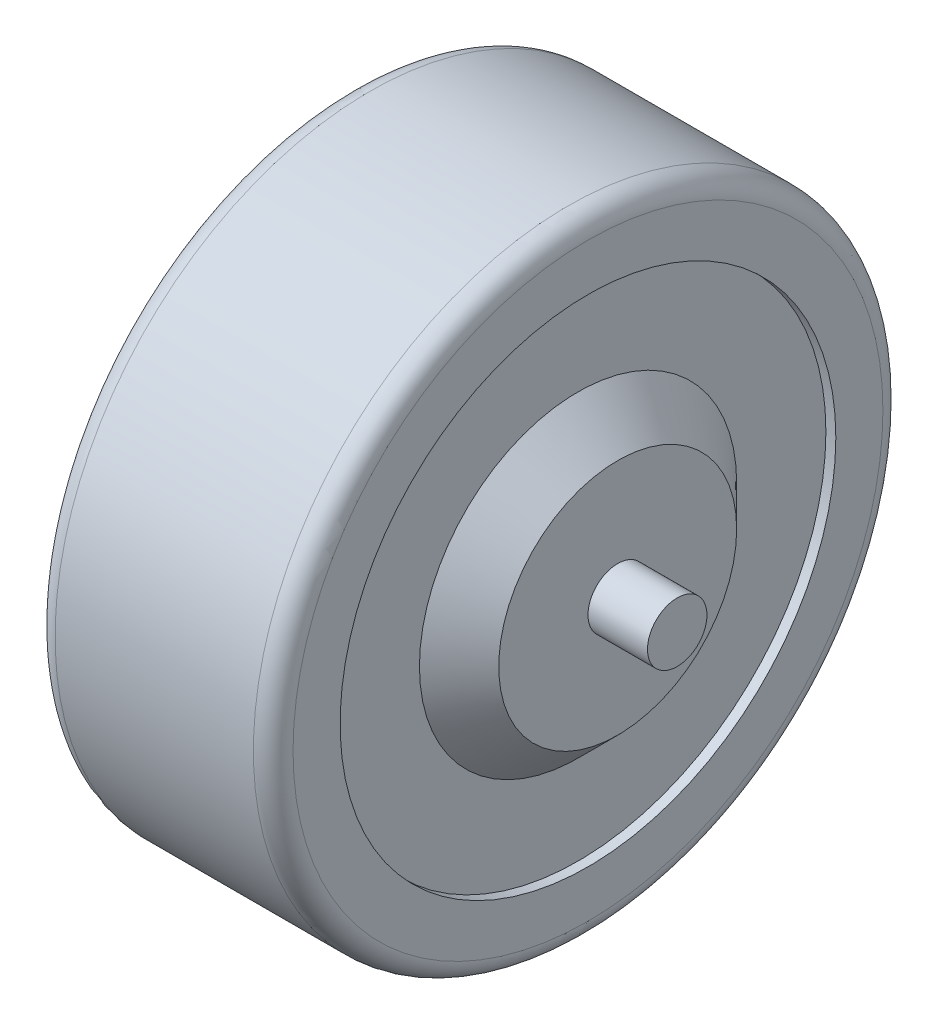
ISO-10303-21;
HEADER;
FILE_DESCRIPTION(('STEP AP214'),'2;1');
FILE_NAME('part.step','',(''),(''),'','','');
FILE_SCHEMA(('AUTOMOTIVE_DESIGN { 1 0 10303 214 1 1 1 1 }'));
ENDSEC;
DATA;
#1=APPLICATION_CONTEXT('core data for automotive mechanical design processes');
#2=APPLICATION_PROTOCOL_DEFINITION('international standard','automotive_design',2000,#1);
#3=PRODUCT_CONTEXT('',#1,'mechanical');
#4=PRODUCT('Part','Part','',(#3));
#5=PRODUCT_RELATED_PRODUCT_CATEGORY('part','',(#4));
#6=PRODUCT_DEFINITION_FORMATION('','',#4);
#7=PRODUCT_DEFINITION_CONTEXT('part definition',#1,'design');
#8=PRODUCT_DEFINITION('design','',#6,#7);
#9=PRODUCT_DEFINITION_SHAPE('','',#8);
#10=(LENGTH_UNIT() NAMED_UNIT(*) SI_UNIT(.MILLI.,.METRE.));
#11=(NAMED_UNIT(*) PLANE_ANGLE_UNIT() SI_UNIT($,.RADIAN.));
#12=(NAMED_UNIT(*) SI_UNIT($,.STERADIAN.) SOLID_ANGLE_UNIT());
#13=UNCERTAINTY_MEASURE_WITH_UNIT(LENGTH_MEASURE(1.E-05),#10,'distance_accuracy_value','');
#14=(GEOMETRIC_REPRESENTATION_CONTEXT(3) GLOBAL_UNCERTAINTY_ASSIGNED_CONTEXT((#13)) GLOBAL_UNIT_ASSIGNED_CONTEXT((#10,
#11,#12)) REPRESENTATION_CONTEXT('',''));
#15=CARTESIAN_POINT('',(0.,0.,0.));
#16=DIRECTION('',(0.,0.,1.));
#17=DIRECTION('',(1.,0.,0.));
#18=AXIS2_PLACEMENT_3D('',#15,#16,#17);
#19=CARTESIAN_POINT('',(11.6415,0.,0.));
#20=DIRECTION('',(1.,0.,0.));
#21=DIRECTION('',(0.,0.,-1.));
#22=AXIS2_PLACEMENT_3D('',#19,#20,#21);
#23=PLANE('',#22);
#24=CARTESIAN_POINT('',(11.6415,0.,0.));
#25=DIRECTION('',(1.,0.,0.));
#26=DIRECTION('',(0.,0.,-1.));
#27=AXIS2_PLACEMENT_3D('',#24,#25,#26);
#28=CIRCLE('',#27,9.3132);
#29=CARTESIAN_POINT('',(11.6415,0.,-9.3132));
#30=VERTEX_POINT('',#29);
#31=EDGE_CURVE('E68',#30,#30,#28,.T.);
#32=ORIENTED_EDGE('',*,*,#31,.T.);
#33=EDGE_LOOP('',(#32));
#34=FACE_BOUND('',#33,.T.);
#35=CARTESIAN_POINT('',(11.6415,0.,0.));
#36=DIRECTION('',(1.,0.,0.));
#37=DIRECTION('',(0.,0.,-1.));
#38=AXIS2_PLACEMENT_3D('',#35,#36,#37);
#39=CIRCLE('',#38,2.3283);
#40=CARTESIAN_POINT('',(11.6415,0.,-2.3283));
#41=VERTEX_POINT('',#40);
#42=EDGE_CURVE('E101',#41,#41,#39,.T.);
#43=ORIENTED_EDGE('',*,*,#42,.F.);
#44=EDGE_LOOP('',(#43));
#45=FACE_BOUND('',#44,.T.);
#46=ADVANCED_FACE('F40',(#34,#45),#23,.T.);
#47=CARTESIAN_POINT('',(-9.3132,0.,0.));
#48=DIRECTION('',(1.,0.,0.));
#49=DIRECTION('',(0.,0.,-1.));
#50=AXIS2_PLACEMENT_3D('',#47,#48,#49);
#51=PLANE('',#50);
#52=CARTESIAN_POINT('',(-9.3132,0.,0.));
#53=DIRECTION('',(1.,0.,0.));
#54=DIRECTION('',(0.,0.,-1.));
#55=AXIS2_PLACEMENT_3D('',#52,#53,#54);
#56=CIRCLE('',#55,23.088975);
#57=CARTESIAN_POINT('',(-9.3132,0.,-23.088975));
#58=VERTEX_POINT('',#57);
#59=EDGE_CURVE('E48',#58,#58,#56,.F.);
#60=ORIENTED_EDGE('',*,*,#59,.T.);
#61=EDGE_LOOP('',(#60));
#62=FACE_BOUND('',#61,.T.);
#63=CARTESIAN_POINT('',(-9.3132,0.,0.));
#64=DIRECTION('',(1.,0.,0.));
#65=DIRECTION('',(0.,0.,-1.));
#66=AXIS2_PLACEMENT_3D('',#63,#64,#65);
#67=CIRCLE('',#66,19.4025);
#68=CARTESIAN_POINT('',(-9.3132,0.,-19.4025));
#69=VERTEX_POINT('',#68);
#70=EDGE_CURVE('E89',#69,#69,#67,.T.);
#71=ORIENTED_EDGE('',*,*,#70,.T.);
#72=EDGE_LOOP('',(#71));
#73=FACE_BOUND('',#72,.T.);
#74=ADVANCED_FACE('F124',(#62,#73),#51,.F.);
#75=CARTESIAN_POINT('',(-9.3132,0.,0.));
#76=DIRECTION('',(1.,0.,0.));
#77=DIRECTION('',(0.,0.,-1.));
#78=AXIS2_PLACEMENT_3D('',#75,#76,#77);
#79=CYLINDRICAL_SURFACE('',#78,24.641175);
#80=CARTESIAN_POINT('',(7.761,0.,0.));
#81=DIRECTION('',(1.,0.,0.));
#82=DIRECTION('',(0.,0.,-1.));
#83=AXIS2_PLACEMENT_3D('',#80,#81,#82);
#84=CIRCLE('',#83,24.641175);
#85=CARTESIAN_POINT('',(7.761,0.,-24.641175));
#86=VERTEX_POINT('',#85);
#87=EDGE_CURVE('E53',#86,#86,#84,.F.);
#88=ORIENTED_EDGE('',*,*,#87,.T.);
#89=EDGE_LOOP('',(#88));
#90=FACE_BOUND('',#89,.T.);
#91=CARTESIAN_POINT('',(-7.761,0.,0.));
#92=DIRECTION('',(1.,0.,0.));
#93=DIRECTION('',(0.,0.,-1.));
#94=AXIS2_PLACEMENT_3D('',#91,#92,#93);
#95=CIRCLE('',#94,24.641175);
#96=CARTESIAN_POINT('',(-7.761,0.,-24.641175));
#97=VERTEX_POINT('',#96);
#98=EDGE_CURVE('E58',#97,#97,#95,.T.);
#99=ORIENTED_EDGE('',*,*,#98,.T.);
#100=EDGE_LOOP('',(#99));
#101=FACE_BOUND('',#100,.T.);
#102=ADVANCED_FACE('F130',(#90,#101),#79,.T.);
#103=CARTESIAN_POINT('',(9.3132,0.,0.));
#104=DIRECTION('',(1.,0.,0.));
#105=DIRECTION('',(0.,0.,-1.));
#106=AXIS2_PLACEMENT_3D('',#103,#104,#105);
#107=PLANE('',#106);
#108=CARTESIAN_POINT('',(9.3132,0.,0.));
#109=DIRECTION('',(1.,0.,0.));
#110=DIRECTION('',(0.,0.,-1.));
#111=AXIS2_PLACEMENT_3D('',#108,#109,#110);
#112=CIRCLE('',#111,23.088975);
#113=CARTESIAN_POINT('',(9.3132,0.,-23.088975));
#114=VERTEX_POINT('',#113);
#115=EDGE_CURVE('E64',#114,#114,#112,.T.);
#116=ORIENTED_EDGE('',*,*,#115,.T.);
#117=EDGE_LOOP('',(#116));
#118=FACE_BOUND('',#117,.T.);
#119=CARTESIAN_POINT('',(9.3132,0.,0.));
#120=DIRECTION('',(1.,0.,0.));
#121=DIRECTION('',(0.,0.,-1.));
#122=AXIS2_PLACEMENT_3D('',#119,#120,#121);
#123=CIRCLE('',#122,19.4025);
#124=CARTESIAN_POINT('',(9.3132,0.,-19.4025));
#125=VERTEX_POINT('',#124);
#126=EDGE_CURVE('E77',#125,#125,#123,.T.);
#127=ORIENTED_EDGE('',*,*,#126,.F.);
#128=EDGE_LOOP('',(#127));
#129=FACE_BOUND('',#128,.T.);
#130=ADVANCED_FACE('F145',(#118,#129),#107,.T.);
#131=CARTESIAN_POINT('',(8.5371,0.,0.));
#132=DIRECTION('',(1.,0.,0.));
#133=DIRECTION('',(0.,0.,-1.));
#134=AXIS2_PLACEMENT_3D('',#131,#132,#133);
#135=CYLINDRICAL_SURFACE('',#134,19.4025);
#136=CARTESIAN_POINT('',(8.5371,0.,0.));
#137=DIRECTION('',(1.,0.,0.));
#138=DIRECTION('',(0.,0.,-1.));
#139=AXIS2_PLACEMENT_3D('',#136,#137,#138);
#140=CIRCLE('',#139,19.4025);
#141=CARTESIAN_POINT('',(8.5371,0.,-19.4025));
#142=VERTEX_POINT('',#141);
#143=EDGE_CURVE('E76',#142,#142,#140,.T.);
#144=ORIENTED_EDGE('',*,*,#143,.F.);
#145=EDGE_LOOP('',(#144));
#146=FACE_BOUND('',#145,.T.);
#147=ORIENTED_EDGE('',*,*,#126,.T.);
#148=EDGE_LOOP('',(#147));
#149=FACE_BOUND('',#148,.T.);
#150=ADVANCED_FACE('F141',(#146,#149),#135,.F.);
#151=CARTESIAN_POINT('',(8.5371,0.,0.));
#152=DIRECTION('',(1.,0.,0.));
#153=DIRECTION('',(0.,0.,-1.));
#154=AXIS2_PLACEMENT_3D('',#151,#152,#153);
#155=PLANE('',#154);
#156=CARTESIAN_POINT('',(8.5371,0.,0.));
#157=DIRECTION('',(1.,0.,0.));
#158=DIRECTION('',(0.,0.,-1.));
#159=AXIS2_PLACEMENT_3D('',#156,#157,#158);
#160=CIRCLE('',#159,12.4176);
#161=CARTESIAN_POINT('',(8.5371,0.,-12.4176));
#162=VERTEX_POINT('',#161);
#163=EDGE_CURVE('E81',#162,#162,#160,.T.);
#164=ORIENTED_EDGE('',*,*,#163,.F.);
#165=EDGE_LOOP('',(#164));
#166=FACE_BOUND('',#165,.T.);
#167=ORIENTED_EDGE('',*,*,#143,.T.);
#168=EDGE_LOOP('',(#167));
#169=FACE_BOUND('',#168,.T.);
#170=ADVANCED_FACE('F137',(#166,#169),#155,.T.);
#171=CARTESIAN_POINT('',(-8.5371,0.,0.));
#172=DIRECTION('',(-1.,0.,0.));
#173=DIRECTION('',(0.,0.,-1.));
#174=AXIS2_PLACEMENT_3D('',#171,#172,#173);
#175=PLANE('',#174);
#176=CARTESIAN_POINT('',(-8.5371,0.,0.));
#177=DIRECTION('',(1.,0.,0.));
#178=DIRECTION('',(0.,0.,-1.));
#179=AXIS2_PLACEMENT_3D('',#176,#177,#178);
#180=CIRCLE('',#179,19.4025);
#181=CARTESIAN_POINT('',(-8.5371,0.,-19.4025));
#182=VERTEX_POINT('',#181);
#183=EDGE_CURVE('E88',#182,#182,#180,.T.);
#184=ORIENTED_EDGE('',*,*,#183,.F.);
#185=EDGE_LOOP('',(#184));
#186=FACE_BOUND('',#185,.T.);
#187=CARTESIAN_POINT('',(-8.5371,0.,0.));
#188=DIRECTION('',(1.,0.,0.));
#189=DIRECTION('',(0.,0.,-1.));
#190=AXIS2_PLACEMENT_3D('',#187,#188,#189);
#191=CIRCLE('',#190,12.4176);
#192=CARTESIAN_POINT('',(-8.5371,0.,-12.4176));
#193=VERTEX_POINT('',#192);
#194=EDGE_CURVE('E93',#193,#193,#191,.T.);
#195=ORIENTED_EDGE('',*,*,#194,.T.);
#196=EDGE_LOOP('',(#195));
#197=FACE_BOUND('',#196,.T.);
#198=ADVANCED_FACE('F140',(#186,#197),#175,.T.);
#199=CARTESIAN_POINT('',(-8.5371,0.,0.));
#200=DIRECTION('',(-1.,0.,0.));
#201=DIRECTION('',(0.,0.,1.));
#202=AXIS2_PLACEMENT_3D('',#199,#200,#201);
#203=CYLINDRICAL_SURFACE('',#202,19.4025);
#204=ORIENTED_EDGE('',*,*,#183,.T.);
#205=EDGE_LOOP('',(#204));
#206=FACE_BOUND('',#205,.T.);
#207=ORIENTED_EDGE('',*,*,#70,.F.);
#208=EDGE_LOOP('',(#207));
#209=FACE_BOUND('',#208,.T.);
#210=ADVANCED_FACE('F135',(#206,#209),#203,.F.);
#211=CARTESIAN_POINT('',(-11.6415,0.,0.));
#212=DIRECTION('',(-1.,0.,0.));
#213=DIRECTION('',(0.,0.,-1.));
#214=AXIS2_PLACEMENT_3D('',#211,#212,#213);
#215=PLANE('',#214);
#216=CARTESIAN_POINT('',(-11.6415,0.,0.));
#217=DIRECTION('',(-1.,0.,0.));
#218=DIRECTION('',(0.,0.,1.));
#219=AXIS2_PLACEMENT_3D('',#216,#217,#218);
#220=CIRCLE('',#219,2.3283);
#221=CARTESIAN_POINT('',(-11.6415,0.,2.3283));
#222=VERTEX_POINT('',#221);
#223=EDGE_CURVE('E10',#222,#222,#220,.T.);
#224=ORIENTED_EDGE('',*,*,#223,.F.);
#225=EDGE_LOOP('',(#224));
#226=FACE_BOUND('',#225,.T.);
#227=CARTESIAN_POINT('',(-11.6415,0.,0.));
#228=DIRECTION('',(-1.,0.,0.));
#229=DIRECTION('',(0.,0.,1.));
#230=AXIS2_PLACEMENT_3D('',#227,#228,#229);
#231=CIRCLE('',#230,9.31319999999999);
#232=CARTESIAN_POINT('',(-11.6415,0.,9.31319999999999));
#233=VERTEX_POINT('',#232);
#234=EDGE_CURVE('E72',#233,#233,#231,.T.);
#235=ORIENTED_EDGE('',*,*,#234,.T.);
#236=EDGE_LOOP('',(#235));
#237=FACE_BOUND('',#236,.T.);
#238=ADVANCED_FACE('F157',(#226,#237),#215,.T.);
#239=CARTESIAN_POINT('',(-8.5371,0.,0.));
#240=DIRECTION('',(1.,0.,0.));
#241=DIRECTION('',(0.,0.,-1.));
#242=AXIS2_PLACEMENT_3D('',#239,#240,#241);
#243=CONICAL_SURFACE('',#242,12.4176,0.78539816339745);
#244=ORIENTED_EDGE('',*,*,#234,.F.);
#245=EDGE_LOOP('',(#244));
#246=FACE_BOUND('',#245,.T.);
#247=ORIENTED_EDGE('',*,*,#194,.F.);
#248=EDGE_LOOP('',(#247));
#249=FACE_BOUND('',#248,.T.);
#250=ADVANCED_FACE('F153',(#246,#249),#243,.T.);
#251=CARTESIAN_POINT('',(11.6415,0.,0.));
#252=DIRECTION('',(-1.,0.,0.));
#253=DIRECTION('',(0.,0.,1.));
#254=AXIS2_PLACEMENT_3D('',#251,#252,#253);
#255=CONICAL_SURFACE('',#254,9.3132,0.785398163397445);
#256=ORIENTED_EDGE('',*,*,#163,.T.);
#257=EDGE_LOOP('',(#256));
#258=FACE_BOUND('',#257,.T.);
#259=ORIENTED_EDGE('',*,*,#31,.F.);
#260=EDGE_LOOP('',(#259));
#261=FACE_BOUND('',#260,.T.);
#262=ADVANCED_FACE('F156',(#258,#261),#255,.T.);
#263=CARTESIAN_POINT('',(7.761,0.,0.));
#264=DIRECTION('',(1.,0.,0.));
#265=DIRECTION('',(0.,0.,-1.));
#266=AXIS2_PLACEMENT_3D('',#263,#264,#265);
#267=TOROIDAL_SURFACE('',#266,23.088975,1.5522);
#268=ORIENTED_EDGE('',*,*,#87,.F.);
#269=EDGE_LOOP('',(#268));
#270=FACE_BOUND('',#269,.T.);
#271=ORIENTED_EDGE('',*,*,#115,.F.);
#272=EDGE_LOOP('',(#271));
#273=FACE_BOUND('',#272,.T.);
#274=ADVANCED_FACE('F160',(#270,#273),#267,.T.);
#275=CARTESIAN_POINT('',(-7.761,0.,0.));
#276=DIRECTION('',(1.,0.,0.));
#277=DIRECTION('',(0.,0.,-1.));
#278=AXIS2_PLACEMENT_3D('',#275,#276,#277);
#279=TOROIDAL_SURFACE('',#278,23.088975,1.5522);
#280=ORIENTED_EDGE('',*,*,#59,.F.);
#281=EDGE_LOOP('',(#280));
#282=FACE_BOUND('',#281,.T.);
#283=ORIENTED_EDGE('',*,*,#98,.F.);
#284=EDGE_LOOP('',(#283));
#285=FACE_BOUND('',#284,.T.);
#286=ADVANCED_FACE('F42',(#282,#285),#279,.T.);
#287=CARTESIAN_POINT('',(16.2981,0.,0.));
#288=DIRECTION('',(-1.,0.,0.));
#289=DIRECTION('',(0.,0.,1.));
#290=AXIS2_PLACEMENT_3D('',#287,#288,#289);
#291=CYLINDRICAL_SURFACE('',#290,2.3283);
#292=CARTESIAN_POINT('',(16.2981,0.,0.));
#293=DIRECTION('',(1.,0.,0.));
#294=DIRECTION('',(0.,0.,-1.));
#295=AXIS2_PLACEMENT_3D('',#292,#293,#294);
#296=CIRCLE('',#295,2.3283);
#297=CARTESIAN_POINT('',(16.2981,0.,-2.3283));
#298=VERTEX_POINT('',#297);
#299=EDGE_CURVE('E100',#298,#298,#296,.T.);
#300=ORIENTED_EDGE('',*,*,#299,.F.);
#301=EDGE_LOOP('',(#300));
#302=FACE_BOUND('',#301,.T.);
#303=ORIENTED_EDGE('',*,*,#42,.T.);
#304=EDGE_LOOP('',(#303));
#305=FACE_BOUND('',#304,.T.);
#306=ADVANCED_FACE('F167',(#302,#305),#291,.T.);
#307=CARTESIAN_POINT('',(16.2981,0.,0.));
#308=DIRECTION('',(1.,0.,0.));
#309=DIRECTION('',(0.,0.,-1.));
#310=AXIS2_PLACEMENT_3D('',#307,#308,#309);
#311=PLANE('',#310);
#312=ORIENTED_EDGE('',*,*,#299,.T.);
#313=EDGE_LOOP('',(#312));
#314=FACE_BOUND('',#313,.T.);
#315=ADVANCED_FACE('F121',(#314),#311,.T.);
#316=CARTESIAN_POINT('',(-16.2981,0.,0.));
#317=DIRECTION('',(1.,0.,0.));
#318=DIRECTION('',(0.,0.,-1.));
#319=AXIS2_PLACEMENT_3D('',#316,#317,#318);
#320=CYLINDRICAL_SURFACE('',#319,2.3283);
#321=CARTESIAN_POINT('',(-16.2981,0.,0.));
#322=DIRECTION('',(1.,0.,0.));
#323=DIRECTION('',(0.,0.,-1.));
#324=AXIS2_PLACEMENT_3D('',#321,#322,#323);
#325=CIRCLE('',#324,2.3283);
#326=CARTESIAN_POINT('',(-16.2981,0.,-2.3283));
#327=VERTEX_POINT('',#326);
#328=EDGE_CURVE('E105',#327,#327,#325,.T.);
#329=ORIENTED_EDGE('',*,*,#328,.T.);
#330=EDGE_LOOP('',(#329));
#331=FACE_BOUND('',#330,.T.);
#332=ORIENTED_EDGE('',*,*,#223,.T.);
#333=EDGE_LOOP('',(#332));
#334=FACE_BOUND('',#333,.T.);
#335=ADVANCED_FACE('F113',(#331,#334),#320,.T.);
#336=CARTESIAN_POINT('',(-16.2981,0.,0.));
#337=DIRECTION('',(-1.,0.,0.));
#338=DIRECTION('',(0.,0.,-1.));
#339=AXIS2_PLACEMENT_3D('',#336,#337,#338);
#340=PLANE('',#339);
#341=ORIENTED_EDGE('',*,*,#328,.F.);
#342=EDGE_LOOP('',(#341));
#343=FACE_BOUND('',#342,.T.);
#344=ADVANCED_FACE('F115',(#343),#340,.T.);
#345=CLOSED_SHELL('',(#46,#74,#102,#130,#150,#170,#198,#210,#238,#250,#262,#274,#286,#306,#315,
#335,#344));
#346=MANIFOLD_SOLID_BREP('B2',#345);
#347=ADVANCED_BREP_SHAPE_REPRESENTATION('',(#18,#346),#14);
#348=SHAPE_DEFINITION_REPRESENTATION(#9,#347);
ENDSEC;
END-ISO-10303-21;
